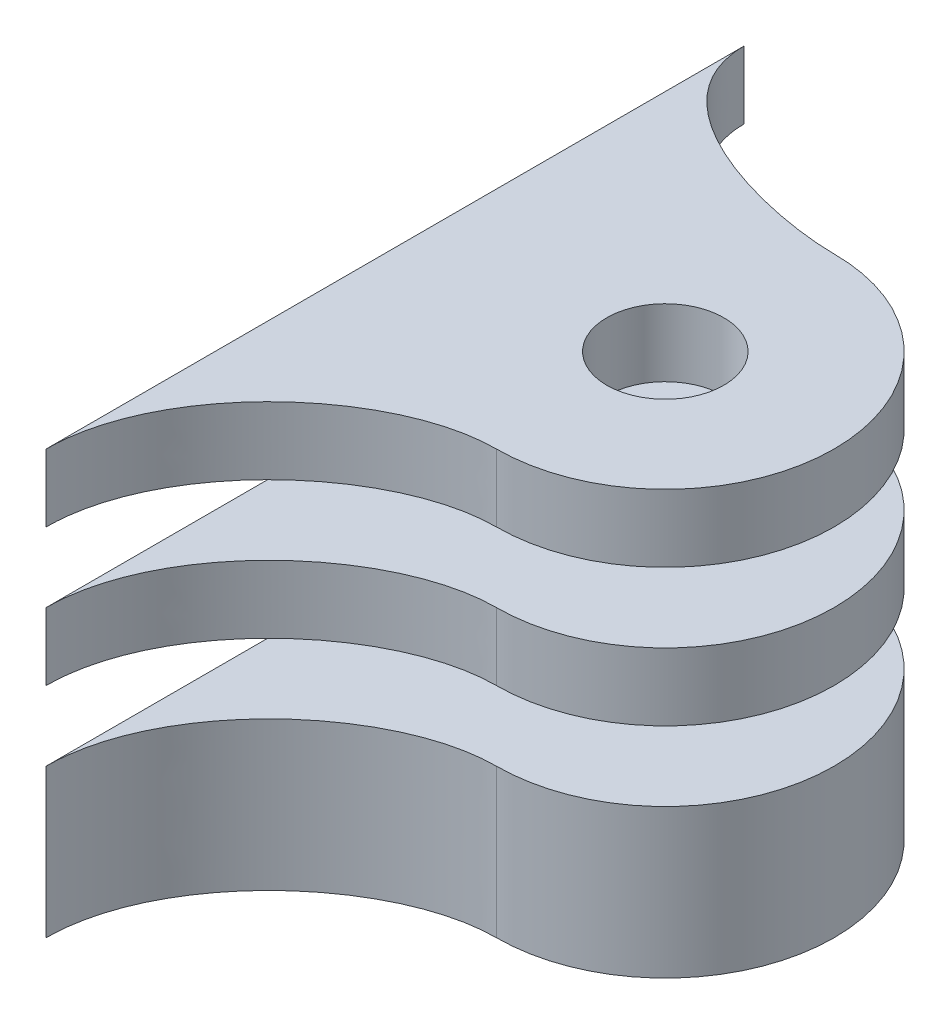
ISO-10303-21;
HEADER;
FILE_DESCRIPTION(('STEP AP214'),'2;1');
FILE_NAME('part.step','',(''),(''),'','','');
FILE_SCHEMA(('AUTOMOTIVE_DESIGN { 1 0 10303 214 1 1 1 1 }'));
ENDSEC;
DATA;
#1=APPLICATION_CONTEXT('core data for automotive mechanical design processes');
#2=APPLICATION_PROTOCOL_DEFINITION('international standard','automotive_design',2000,#1);
#3=PRODUCT_CONTEXT('',#1,'mechanical');
#4=PRODUCT('Part','Part','',(#3));
#5=PRODUCT_RELATED_PRODUCT_CATEGORY('part','',(#4));
#6=PRODUCT_DEFINITION_FORMATION('','',#4);
#7=PRODUCT_DEFINITION_CONTEXT('part definition',#1,'design');
#8=PRODUCT_DEFINITION('design','',#6,#7);
#9=PRODUCT_DEFINITION_SHAPE('','',#8);
#10=(LENGTH_UNIT() NAMED_UNIT(*) SI_UNIT(.MILLI.,.METRE.));
#11=(NAMED_UNIT(*) PLANE_ANGLE_UNIT() SI_UNIT($,.RADIAN.));
#12=(NAMED_UNIT(*) SI_UNIT($,.STERADIAN.) SOLID_ANGLE_UNIT());
#13=UNCERTAINTY_MEASURE_WITH_UNIT(LENGTH_MEASURE(1.E-05),#10,'distance_accuracy_value','');
#14=(GEOMETRIC_REPRESENTATION_CONTEXT(3) GLOBAL_UNCERTAINTY_ASSIGNED_CONTEXT((#13)) GLOBAL_UNIT_ASSIGNED_CONTEXT((#10,
#11,#12)) REPRESENTATION_CONTEXT('',''));
#15=CARTESIAN_POINT('',(0.,0.,0.));
#16=DIRECTION('',(0.,0.,1.));
#17=DIRECTION('',(1.,0.,0.));
#18=AXIS2_PLACEMENT_3D('',#15,#16,#17);
#19=CARTESIAN_POINT('',(0.,12.2,7.5));
#20=CARTESIAN_POINT('',(-4.57269446377672,12.2,7.50000000000003));
#21=CARTESIAN_POINT('',(-9.99999999999998,12.2,12.3758328504829));
#22=CARTESIAN_POINT('',(-10.,12.2,17.5));
#23=B_SPLINE_CURVE_WITH_KNOTS('',3,(#19,#20,#21,#22),.UNSPECIFIED.,.F.,.F.,(4,4),(0.,1.),.UNSPECIFIED.);
#24=DIRECTION('',(0.,-1.,0.));
#25=VECTOR('',#24,1.);
#26=SURFACE_OF_LINEAR_EXTRUSION('',#23,#25);
#27=CARTESIAN_POINT('',(0.,9.2,7.5));
#28=CARTESIAN_POINT('',(-4.57269446377672,9.2,7.50000000000003));
#29=CARTESIAN_POINT('',(-9.99999999999998,9.2,12.3758328504829));
#30=CARTESIAN_POINT('',(-10.,9.2,17.5));
#31=B_SPLINE_CURVE_WITH_KNOTS('',3,(#27,#28,#29,#30),.UNSPECIFIED.,.F.,.F.,(4,4),(0.,1.),.UNSPECIFIED.);
#32=CARTESIAN_POINT('',(0.,9.2,7.5));
#33=VERTEX_POINT('',#32);
#34=CARTESIAN_POINT('',(-10.,9.2,17.5));
#35=VERTEX_POINT('',#34);
#36=EDGE_CURVE('E159',#33,#35,#31,.T.);
#37=ORIENTED_EDGE('',*,*,#36,.F.);
#38=DIRECTION('',(0.,-1.,0.));
#39=VECTOR('',#38,1.);
#40=CARTESIAN_POINT('',(0.,12.2,7.5));
#41=LINE('',#40,#39);
#42=CARTESIAN_POINT('',(0.,12.2,7.5));
#43=VERTEX_POINT('',#42);
#44=EDGE_CURVE('E13',#43,#33,#41,.T.);
#45=ORIENTED_EDGE('',*,*,#44,.F.);
#46=CARTESIAN_POINT('',(-10.,12.2,17.5));
#47=VERTEX_POINT('',#46);
#48=EDGE_CURVE('E129',#43,#47,#23,.T.);
#49=ORIENTED_EDGE('',*,*,#48,.T.);
#50=DIRECTION('',(0.,-1.,0.));
#51=VECTOR('',#50,1.);
#52=CARTESIAN_POINT('',(-10.,12.2,17.5));
#53=LINE('',#52,#51);
#54=EDGE_CURVE('E117',#47,#35,#53,.T.);
#55=ORIENTED_EDGE('',*,*,#54,.T.);
#56=EDGE_LOOP('',(#37,#45,#49,#55));
#57=FACE_BOUND('',#56,.T.);
#58=ADVANCED_FACE('F77',(#57),#26,.T.);
#59=CARTESIAN_POINT('',(0.,12.2,0.));
#60=DIRECTION('',(0.,-1.,0.));
#61=DIRECTION('',(0.,0.,-1.));
#62=AXIS2_PLACEMENT_3D('',#59,#60,#61);
#63=CYLINDRICAL_SURFACE('',#62,7.5);
#64=CARTESIAN_POINT('',(0.,9.2,0.));
#65=DIRECTION('',(0.,1.,0.));
#66=DIRECTION('',(0.,0.,1.));
#67=AXIS2_PLACEMENT_3D('',#64,#65,#66);
#68=CIRCLE('',#67,7.5);
#69=CARTESIAN_POINT('',(0.,9.2,-7.5));
#70=VERTEX_POINT('',#69);
#71=EDGE_CURVE('E134',#33,#70,#68,.T.);
#72=ORIENTED_EDGE('',*,*,#71,.T.);
#73=DIRECTION('',(0.,-1.,0.));
#74=VECTOR('',#73,1.);
#75=CARTESIAN_POINT('',(0.,12.2,-7.5));
#76=LINE('',#75,#74);
#77=CARTESIAN_POINT('',(0.,12.2,-7.5));
#78=VERTEX_POINT('',#77);
#79=EDGE_CURVE('E86',#78,#70,#76,.T.);
#80=ORIENTED_EDGE('',*,*,#79,.F.);
#81=CARTESIAN_POINT('',(0.,12.2,0.));
#82=DIRECTION('',(0.,1.,0.));
#83=DIRECTION('',(0.,0.,1.));
#84=AXIS2_PLACEMENT_3D('',#81,#82,#83);
#85=CIRCLE('',#84,7.5);
#86=EDGE_CURVE('E123',#43,#78,#85,.T.);
#87=ORIENTED_EDGE('',*,*,#86,.F.);
#88=ORIENTED_EDGE('',*,*,#44,.T.);
#89=EDGE_LOOP('',(#72,#80,#87,#88));
#90=FACE_BOUND('',#89,.T.);
#91=ADVANCED_FACE('F132',(#90),#63,.T.);
#92=CARTESIAN_POINT('',(0.,12.2,-7.5));
#93=CARTESIAN_POINT('',(-2.81326336994025,12.2,-7.49999999999998));
#94=CARTESIAN_POINT('',(-10.,12.2,-9.04091329359103));
#95=CARTESIAN_POINT('',(-10.,12.2,-13.5));
#96=B_SPLINE_CURVE_WITH_KNOTS('',3,(#92,#93,#94,#95),.UNSPECIFIED.,.F.,.F.,(4,4),(0.,1.),.UNSPECIFIED.);
#97=DIRECTION('',(0.,-1.,0.));
#98=VECTOR('',#97,1.);
#99=SURFACE_OF_LINEAR_EXTRUSION('',#96,#98);
#100=CARTESIAN_POINT('',(0.,9.2,-7.5));
#101=CARTESIAN_POINT('',(-2.81326336994025,9.2,-7.49999999999998));
#102=CARTESIAN_POINT('',(-10.,9.2,-9.04091329359103));
#103=CARTESIAN_POINT('',(-10.,9.2,-13.5));
#104=B_SPLINE_CURVE_WITH_KNOTS('',3,(#100,#101,#102,#103),.UNSPECIFIED.,.F.,.F.,(4,4),(0.,1.),.UNSPECIFIED.);
#105=CARTESIAN_POINT('',(-10.,9.2,-13.5));
#106=VERTEX_POINT('',#105);
#107=EDGE_CURVE('E110',#70,#106,#104,.T.);
#108=ORIENTED_EDGE('',*,*,#107,.T.);
#109=DIRECTION('',(0.,-1.,0.));
#110=VECTOR('',#109,1.);
#111=CARTESIAN_POINT('',(-10.,12.2,-13.5));
#112=LINE('',#111,#110);
#113=CARTESIAN_POINT('',(-10.,12.2,-13.5));
#114=VERTEX_POINT('',#113);
#115=EDGE_CURVE('E135',#114,#106,#112,.T.);
#116=ORIENTED_EDGE('',*,*,#115,.F.);
#117=EDGE_CURVE('E128',#78,#114,#96,.T.);
#118=ORIENTED_EDGE('',*,*,#117,.F.);
#119=ORIENTED_EDGE('',*,*,#79,.T.);
#120=EDGE_LOOP('',(#108,#116,#118,#119));
#121=FACE_BOUND('',#120,.T.);
#122=ADVANCED_FACE('F136',(#121),#99,.F.);
#123=CARTESIAN_POINT('',(-10.,12.2,0.));
#124=DIRECTION('',(1.,0.,0.));
#125=DIRECTION('',(0.,0.,-1.));
#126=AXIS2_PLACEMENT_3D('',#123,#124,#125);
#127=PLANE('',#126);
#128=DIRECTION('',(0.,0.,1.));
#129=VECTOR('',#128,1.);
#130=CARTESIAN_POINT('',(-10.,9.2,0.));
#131=LINE('',#130,#129);
#132=EDGE_CURVE('E173',#106,#35,#131,.T.);
#133=ORIENTED_EDGE('',*,*,#132,.T.);
#134=ORIENTED_EDGE('',*,*,#54,.F.);
#135=DIRECTION('',(0.,0.,1.));
#136=VECTOR('',#135,1.);
#137=CARTESIAN_POINT('',(-10.,12.2,0.));
#138=LINE('',#137,#136);
#139=EDGE_CURVE('E94',#114,#47,#138,.T.);
#140=ORIENTED_EDGE('',*,*,#139,.F.);
#141=ORIENTED_EDGE('',*,*,#115,.T.);
#142=EDGE_LOOP('',(#133,#134,#140,#141));
#143=FACE_BOUND('',#142,.T.);
#144=ADVANCED_FACE('F150',(#143),#127,.F.);
#145=CARTESIAN_POINT('',(0.,12.2,0.));
#146=DIRECTION('',(0.,-1.,0.));
#147=DIRECTION('',(0.,0.,-1.));
#148=AXIS2_PLACEMENT_3D('',#145,#146,#147);
#149=CYLINDRICAL_SURFACE('',#148,2.6);
#150=CARTESIAN_POINT('',(0.,12.2,0.));
#151=DIRECTION('',(0.,1.,0.));
#152=DIRECTION('',(0.,0.,1.));
#153=AXIS2_PLACEMENT_3D('',#150,#151,#152);
#154=CIRCLE('',#153,2.6);
#155=CARTESIAN_POINT('',(0.,12.2,2.6));
#156=VERTEX_POINT('',#155);
#157=EDGE_CURVE('E138',#156,#156,#154,.T.);
#158=ORIENTED_EDGE('',*,*,#157,.T.);
#159=EDGE_LOOP('',(#158));
#160=FACE_BOUND('',#159,.T.);
#161=CARTESIAN_POINT('',(0.,9.2,0.));
#162=DIRECTION('',(0.,1.,0.));
#163=DIRECTION('',(0.,0.,1.));
#164=AXIS2_PLACEMENT_3D('',#161,#162,#163);
#165=CIRCLE('',#164,2.6);
#166=CARTESIAN_POINT('',(0.,9.2,2.6));
#167=VERTEX_POINT('',#166);
#168=EDGE_CURVE('E178',#167,#167,#165,.T.);
#169=ORIENTED_EDGE('',*,*,#168,.F.);
#170=EDGE_LOOP('',(#169));
#171=FACE_BOUND('',#170,.T.);
#172=ADVANCED_FACE('F189',(#160,#171),#149,.F.);
#173=CARTESIAN_POINT('',(0.,12.2,0.));
#174=DIRECTION('',(0.,1.,0.));
#175=DIRECTION('',(0.,0.,1.));
#176=AXIS2_PLACEMENT_3D('',#173,#174,#175);
#177=PLANE('',#176);
#178=ORIENTED_EDGE('',*,*,#48,.F.);
#179=ORIENTED_EDGE('',*,*,#86,.T.);
#180=ORIENTED_EDGE('',*,*,#117,.T.);
#181=ORIENTED_EDGE('',*,*,#139,.T.);
#182=EDGE_LOOP('',(#178,#179,#180,#181));
#183=FACE_BOUND('',#182,.T.);
#184=ORIENTED_EDGE('',*,*,#157,.F.);
#185=EDGE_LOOP('',(#184));
#186=FACE_BOUND('',#185,.T.);
#187=ADVANCED_FACE('F125',(#183,#186),#177,.T.);
#188=CARTESIAN_POINT('',(0.,9.2,0.));
#189=DIRECTION('',(0.,1.,0.));
#190=DIRECTION('',(0.,0.,1.));
#191=AXIS2_PLACEMENT_3D('',#188,#189,#190);
#192=PLANE('',#191);
#193=ORIENTED_EDGE('',*,*,#36,.T.);
#194=ORIENTED_EDGE('',*,*,#132,.F.);
#195=ORIENTED_EDGE('',*,*,#107,.F.);
#196=ORIENTED_EDGE('',*,*,#71,.F.);
#197=EDGE_LOOP('',(#193,#194,#195,#196));
#198=FACE_BOUND('',#197,.T.);
#199=ORIENTED_EDGE('',*,*,#168,.T.);
#200=EDGE_LOOP('',(#199));
#201=FACE_BOUND('',#200,.T.);
#202=ADVANCED_FACE('F183',(#198,#201),#192,.F.);
#203=CLOSED_SHELL('',(#58,#91,#122,#144,#172,#187,#202));
#204=MANIFOLD_SOLID_BREP('B2',#203);
#205=CARTESIAN_POINT('',(0.,6.1,7.5));
#206=CARTESIAN_POINT('',(-4.57269446377672,6.1,7.50000000000003));
#207=CARTESIAN_POINT('',(-9.99999999999998,6.1,12.3758328504829));
#208=CARTESIAN_POINT('',(-10.,6.1,17.5));
#209=B_SPLINE_CURVE_WITH_KNOTS('',3,(#205,#206,#207,#208),.UNSPECIFIED.,.F.,.F.,(4,4),(0.,1.),.UNSPECIFIED.);
#210=DIRECTION('',(0.,-1.,0.));
#211=VECTOR('',#210,1.);
#212=SURFACE_OF_LINEAR_EXTRUSION('',#209,#211);
#213=CARTESIAN_POINT('',(0.,3.1,7.5));
#214=CARTESIAN_POINT('',(-4.57269446377672,3.1,7.50000000000003));
#215=CARTESIAN_POINT('',(-9.99999999999998,3.1,12.3758328504829));
#216=CARTESIAN_POINT('',(-10.,3.1,17.5));
#217=B_SPLINE_CURVE_WITH_KNOTS('',3,(#213,#214,#215,#216),.UNSPECIFIED.,.F.,.F.,(4,4),(0.,1.),.UNSPECIFIED.);
#218=CARTESIAN_POINT('',(0.,3.1,7.5));
#219=VERTEX_POINT('',#218);
#220=CARTESIAN_POINT('',(-10.,3.1,17.5));
#221=VERTEX_POINT('',#220);
#222=EDGE_CURVE('E359',#219,#221,#217,.T.);
#223=ORIENTED_EDGE('',*,*,#222,.F.);
#224=DIRECTION('',(0.,-1.,0.));
#225=VECTOR('',#224,1.);
#226=CARTESIAN_POINT('',(0.,6.1,7.5));
#227=LINE('',#226,#225);
#228=CARTESIAN_POINT('',(0.,6.1,7.5));
#229=VERTEX_POINT('',#228);
#230=EDGE_CURVE('E75',#229,#219,#227,.T.);
#231=ORIENTED_EDGE('',*,*,#230,.F.);
#232=CARTESIAN_POINT('',(-10.,6.1,17.5));
#233=VERTEX_POINT('',#232);
#234=EDGE_CURVE('E329',#229,#233,#209,.T.);
#235=ORIENTED_EDGE('',*,*,#234,.T.);
#236=DIRECTION('',(0.,-1.,0.));
#237=VECTOR('',#236,1.);
#238=CARTESIAN_POINT('',(-10.,6.1,17.5));
#239=LINE('',#238,#237);
#240=EDGE_CURVE('E317',#233,#221,#239,.T.);
#241=ORIENTED_EDGE('',*,*,#240,.T.);
#242=EDGE_LOOP('',(#223,#231,#235,#241));
#243=FACE_BOUND('',#242,.T.);
#244=ADVANCED_FACE('F277',(#243),#212,.T.);
#245=CARTESIAN_POINT('',(0.,6.1,0.));
#246=DIRECTION('',(0.,-1.,0.));
#247=DIRECTION('',(0.,0.,-1.));
#248=AXIS2_PLACEMENT_3D('',#245,#246,#247);
#249=CYLINDRICAL_SURFACE('',#248,7.5);
#250=CARTESIAN_POINT('',(0.,3.1,0.));
#251=DIRECTION('',(0.,1.,0.));
#252=DIRECTION('',(0.,0.,1.));
#253=AXIS2_PLACEMENT_3D('',#250,#251,#252);
#254=CIRCLE('',#253,7.5);
#255=CARTESIAN_POINT('',(0.,3.1,-7.5));
#256=VERTEX_POINT('',#255);
#257=EDGE_CURVE('E334',#219,#256,#254,.T.);
#258=ORIENTED_EDGE('',*,*,#257,.T.);
#259=DIRECTION('',(0.,-1.,0.));
#260=VECTOR('',#259,1.);
#261=CARTESIAN_POINT('',(0.,6.1,-7.5));
#262=LINE('',#261,#260);
#263=CARTESIAN_POINT('',(0.,6.1,-7.5));
#264=VERTEX_POINT('',#263);
#265=EDGE_CURVE('E286',#264,#256,#262,.T.);
#266=ORIENTED_EDGE('',*,*,#265,.F.);
#267=CARTESIAN_POINT('',(0.,6.1,0.));
#268=DIRECTION('',(0.,1.,0.));
#269=DIRECTION('',(0.,0.,1.));
#270=AXIS2_PLACEMENT_3D('',#267,#268,#269);
#271=CIRCLE('',#270,7.5);
#272=EDGE_CURVE('E323',#229,#264,#271,.T.);
#273=ORIENTED_EDGE('',*,*,#272,.F.);
#274=ORIENTED_EDGE('',*,*,#230,.T.);
#275=EDGE_LOOP('',(#258,#266,#273,#274));
#276=FACE_BOUND('',#275,.T.);
#277=ADVANCED_FACE('F332',(#276),#249,.T.);
#278=CARTESIAN_POINT('',(0.,6.1,-7.5));
#279=CARTESIAN_POINT('',(-2.81326336994025,6.1,-7.49999999999998));
#280=CARTESIAN_POINT('',(-10.,6.1,-9.04091329359103));
#281=CARTESIAN_POINT('',(-10.,6.1,-13.5));
#282=B_SPLINE_CURVE_WITH_KNOTS('',3,(#278,#279,#280,#281),.UNSPECIFIED.,.F.,.F.,(4,4),(0.,1.),.UNSPECIFIED.);
#283=DIRECTION('',(0.,-1.,0.));
#284=VECTOR('',#283,1.);
#285=SURFACE_OF_LINEAR_EXTRUSION('',#282,#284);
#286=CARTESIAN_POINT('',(0.,3.1,-7.5));
#287=CARTESIAN_POINT('',(-2.81326336994025,3.1,-7.49999999999998));
#288=CARTESIAN_POINT('',(-10.,3.1,-9.04091329359103));
#289=CARTESIAN_POINT('',(-10.,3.1,-13.5));
#290=B_SPLINE_CURVE_WITH_KNOTS('',3,(#286,#287,#288,#289),.UNSPECIFIED.,.F.,.F.,(4,4),(0.,1.),.UNSPECIFIED.);
#291=CARTESIAN_POINT('',(-10.,3.1,-13.5));
#292=VERTEX_POINT('',#291);
#293=EDGE_CURVE('E310',#256,#292,#290,.T.);
#294=ORIENTED_EDGE('',*,*,#293,.T.);
#295=DIRECTION('',(0.,-1.,0.));
#296=VECTOR('',#295,1.);
#297=CARTESIAN_POINT('',(-10.,6.1,-13.5));
#298=LINE('',#297,#296);
#299=CARTESIAN_POINT('',(-10.,6.1,-13.5));
#300=VERTEX_POINT('',#299);
#301=EDGE_CURVE('E335',#300,#292,#298,.T.);
#302=ORIENTED_EDGE('',*,*,#301,.F.);
#303=EDGE_CURVE('E328',#264,#300,#282,.T.);
#304=ORIENTED_EDGE('',*,*,#303,.F.);
#305=ORIENTED_EDGE('',*,*,#265,.T.);
#306=EDGE_LOOP('',(#294,#302,#304,#305));
#307=FACE_BOUND('',#306,.T.);
#308=ADVANCED_FACE('F336',(#307),#285,.F.);
#309=CARTESIAN_POINT('',(-10.,6.1,0.));
#310=DIRECTION('',(1.,0.,0.));
#311=DIRECTION('',(0.,0.,-1.));
#312=AXIS2_PLACEMENT_3D('',#309,#310,#311);
#313=PLANE('',#312);
#314=DIRECTION('',(0.,0.,1.));
#315=VECTOR('',#314,1.);
#316=CARTESIAN_POINT('',(-10.,3.1,0.));
#317=LINE('',#316,#315);
#318=EDGE_CURVE('E373',#292,#221,#317,.T.);
#319=ORIENTED_EDGE('',*,*,#318,.T.);
#320=ORIENTED_EDGE('',*,*,#240,.F.);
#321=DIRECTION('',(0.,0.,1.));
#322=VECTOR('',#321,1.);
#323=CARTESIAN_POINT('',(-10.,6.1,0.));
#324=LINE('',#323,#322);
#325=EDGE_CURVE('E294',#300,#233,#324,.T.);
#326=ORIENTED_EDGE('',*,*,#325,.F.);
#327=ORIENTED_EDGE('',*,*,#301,.T.);
#328=EDGE_LOOP('',(#319,#320,#326,#327));
#329=FACE_BOUND('',#328,.T.);
#330=ADVANCED_FACE('F350',(#329),#313,.F.);
#331=CARTESIAN_POINT('',(0.,6.1,0.));
#332=DIRECTION('',(0.,-1.,0.));
#333=DIRECTION('',(0.,0.,-1.));
#334=AXIS2_PLACEMENT_3D('',#331,#332,#333);
#335=CYLINDRICAL_SURFACE('',#334,2.6);
#336=CARTESIAN_POINT('',(0.,6.1,0.));
#337=DIRECTION('',(0.,1.,0.));
#338=DIRECTION('',(0.,0.,1.));
#339=AXIS2_PLACEMENT_3D('',#336,#337,#338);
#340=CIRCLE('',#339,2.6);
#341=CARTESIAN_POINT('',(0.,6.1,2.6));
#342=VERTEX_POINT('',#341);
#343=EDGE_CURVE('E338',#342,#342,#340,.T.);
#344=ORIENTED_EDGE('',*,*,#343,.T.);
#345=EDGE_LOOP('',(#344));
#346=FACE_BOUND('',#345,.T.);
#347=CARTESIAN_POINT('',(0.,3.1,0.));
#348=DIRECTION('',(0.,1.,0.));
#349=DIRECTION('',(0.,0.,1.));
#350=AXIS2_PLACEMENT_3D('',#347,#348,#349);
#351=CIRCLE('',#350,2.6);
#352=CARTESIAN_POINT('',(0.,3.1,2.6));
#353=VERTEX_POINT('',#352);
#354=EDGE_CURVE('E378',#353,#353,#351,.T.);
#355=ORIENTED_EDGE('',*,*,#354,.F.);
#356=EDGE_LOOP('',(#355));
#357=FACE_BOUND('',#356,.T.);
#358=ADVANCED_FACE('F389',(#346,#357),#335,.F.);
#359=CARTESIAN_POINT('',(0.,6.1,0.));
#360=DIRECTION('',(0.,1.,0.));
#361=DIRECTION('',(0.,0.,1.));
#362=AXIS2_PLACEMENT_3D('',#359,#360,#361);
#363=PLANE('',#362);
#364=ORIENTED_EDGE('',*,*,#234,.F.);
#365=ORIENTED_EDGE('',*,*,#272,.T.);
#366=ORIENTED_EDGE('',*,*,#303,.T.);
#367=ORIENTED_EDGE('',*,*,#325,.T.);
#368=EDGE_LOOP('',(#364,#365,#366,#367));
#369=FACE_BOUND('',#368,.T.);
#370=ORIENTED_EDGE('',*,*,#343,.F.);
#371=EDGE_LOOP('',(#370));
#372=FACE_BOUND('',#371,.T.);
#373=ADVANCED_FACE('F325',(#369,#372),#363,.T.);
#374=CARTESIAN_POINT('',(0.,3.1,0.));
#375=DIRECTION('',(0.,1.,0.));
#376=DIRECTION('',(0.,0.,1.));
#377=AXIS2_PLACEMENT_3D('',#374,#375,#376);
#378=PLANE('',#377);
#379=ORIENTED_EDGE('',*,*,#222,.T.);
#380=ORIENTED_EDGE('',*,*,#318,.F.);
#381=ORIENTED_EDGE('',*,*,#293,.F.);
#382=ORIENTED_EDGE('',*,*,#257,.F.);
#383=EDGE_LOOP('',(#379,#380,#381,#382));
#384=FACE_BOUND('',#383,.T.);
#385=ORIENTED_EDGE('',*,*,#354,.T.);
#386=EDGE_LOOP('',(#385));
#387=FACE_BOUND('',#386,.T.);
#388=ADVANCED_FACE('F383',(#384,#387),#378,.F.);
#389=CLOSED_SHELL('',(#244,#277,#308,#330,#358,#373,#388));
#390=MANIFOLD_SOLID_BREP('B7',#389);
#391=CARTESIAN_POINT('',(0.,-3.,0.));
#392=DIRECTION('',(0.,1.,0.));
#393=DIRECTION('',(0.,0.,1.));
#394=AXIS2_PLACEMENT_3D('',#391,#392,#393);
#395=CYLINDRICAL_SURFACE('',#394,2.6);
#396=CARTESIAN_POINT('',(0.,-3.,0.));
#397=DIRECTION('',(0.,1.,0.));
#398=DIRECTION('',(0.,0.,1.));
#399=AXIS2_PLACEMENT_3D('',#396,#397,#398);
#400=CIRCLE('',#399,2.6);
#401=CARTESIAN_POINT('',(0.,-3.,2.6));
#402=VERTEX_POINT('',#401);
#403=EDGE_CURVE('E617',#402,#402,#400,.T.);
#404=ORIENTED_EDGE('',*,*,#403,.F.);
#405=EDGE_LOOP('',(#404));
#406=FACE_BOUND('',#405,.T.);
#407=CARTESIAN_POINT('',(0.,0.,0.));
#408=DIRECTION('',(0.,1.,0.));
#409=DIRECTION('',(0.,0.,1.));
#410=AXIS2_PLACEMENT_3D('',#407,#408,#409);
#411=CIRCLE('',#410,2.6);
#412=CARTESIAN_POINT('',(0.,0.,2.6));
#413=VERTEX_POINT('',#412);
#414=EDGE_CURVE('E695',#413,#413,#411,.T.);
#415=ORIENTED_EDGE('',*,*,#414,.T.);
#416=EDGE_LOOP('',(#415));
#417=FACE_BOUND('',#416,.T.);
#418=ADVANCED_FACE('F468',(#406,#417),#395,.F.);
#419=CARTESIAN_POINT('',(-10.,-3.,0.));
#420=DIRECTION('',(-1.,0.,0.));
#421=DIRECTION('',(0.,0.,1.));
#422=AXIS2_PLACEMENT_3D('',#419,#420,#421);
#423=PLANE('',#422);
#424=DIRECTION('',(0.,0.,1.));
#425=VECTOR('',#424,1.);
#426=CARTESIAN_POINT('',(-10.,0.,0.));
#427=LINE('',#426,#425);
#428=CARTESIAN_POINT('',(-10.,0.,-13.5));
#429=VERTEX_POINT('',#428);
#430=CARTESIAN_POINT('',(-10.,0.,17.5));
#431=VERTEX_POINT('',#430);
#432=EDGE_CURVE('E503',#429,#431,#427,.T.);
#433=ORIENTED_EDGE('',*,*,#432,.F.);
#434=DIRECTION('',(0.,1.,0.));
#435=VECTOR('',#434,1.);
#436=CARTESIAN_POINT('',(-10.,-3.,-13.5));
#437=LINE('',#436,#435);
#438=CARTESIAN_POINT('',(-10.,-6.6,-13.5));
#439=VERTEX_POINT('',#438);
#440=EDGE_CURVE('E473',#439,#429,#437,.T.);
#441=ORIENTED_EDGE('',*,*,#440,.F.);
#442=DIRECTION('',(0.,0.,-1.));
#443=VECTOR('',#442,1.);
#444=CARTESIAN_POINT('',(-10.,-6.6,0.));
#445=LINE('',#444,#443);
#446=CARTESIAN_POINT('',(-10.,-6.6,17.5));
#447=VERTEX_POINT('',#446);
#448=EDGE_CURVE('E568',#447,#439,#445,.T.);
#449=ORIENTED_EDGE('',*,*,#448,.F.);
#450=DIRECTION('',(0.,1.,0.));
#451=VECTOR('',#450,1.);
#452=CARTESIAN_POINT('',(-10.,-3.,17.5));
#453=LINE('',#452,#451);
#454=EDGE_CURVE('E275',#447,#431,#453,.T.);
#455=ORIENTED_EDGE('',*,*,#454,.T.);
#456=EDGE_LOOP('',(#433,#441,#449,#455));
#457=FACE_BOUND('',#456,.T.);
#458=ADVANCED_FACE('F572',(#457),#423,.T.);
#459=CARTESIAN_POINT('',(0.,-3.,0.));
#460=DIRECTION('',(0.,1.,0.));
#461=DIRECTION('',(0.,0.,1.));
#462=AXIS2_PLACEMENT_3D('',#459,#460,#461);
#463=CYLINDRICAL_SURFACE('',#462,7.5);
#464=CARTESIAN_POINT('',(0.,0.,0.));
#465=DIRECTION('',(0.,1.,0.));
#466=DIRECTION('',(0.,0.,1.));
#467=AXIS2_PLACEMENT_3D('',#464,#465,#466);
#468=CIRCLE('',#467,7.5);
#469=CARTESIAN_POINT('',(0.,0.,7.5));
#470=VERTEX_POINT('',#469);
#471=CARTESIAN_POINT('',(0.,0.,-7.5));
#472=VERTEX_POINT('',#471);
#473=EDGE_CURVE('E701',#470,#472,#468,.T.);
#474=ORIENTED_EDGE('',*,*,#473,.F.);
#475=DIRECTION('',(0.,1.,0.));
#476=VECTOR('',#475,1.);
#477=CARTESIAN_POINT('',(0.,-3.,7.5));
#478=LINE('',#477,#476);
#479=CARTESIAN_POINT('',(0.,-6.6,7.5));
#480=VERTEX_POINT('',#479);
#481=EDGE_CURVE('E694',#480,#470,#478,.T.);
#482=ORIENTED_EDGE('',*,*,#481,.F.);
#483=CARTESIAN_POINT('',(0.,-6.6,0.));
#484=DIRECTION('',(0.,-1.,0.));
#485=DIRECTION('',(0.,0.,-1.));
#486=AXIS2_PLACEMENT_3D('',#483,#484,#485);
#487=CIRCLE('',#486,7.5);
#488=CARTESIAN_POINT('',(0.,-6.6,-7.5));
#489=VERTEX_POINT('',#488);
#490=EDGE_CURVE('E570',#489,#480,#487,.T.);
#491=ORIENTED_EDGE('',*,*,#490,.F.);
#492=DIRECTION('',(0.,1.,0.));
#493=VECTOR('',#492,1.);
#494=CARTESIAN_POINT('',(0.,-3.,-7.5));
#495=LINE('',#494,#493);
#496=EDGE_CURVE('E478',#489,#472,#495,.T.);
#497=ORIENTED_EDGE('',*,*,#496,.T.);
#498=EDGE_LOOP('',(#474,#482,#491,#497));
#499=FACE_BOUND('',#498,.T.);
#500=ADVANCED_FACE('F625',(#499),#463,.T.);
#501=CARTESIAN_POINT('',(0.,-3.,7.5));
#502=CARTESIAN_POINT('',(-4.57269446377672,-3.,7.50000000000003));
#503=CARTESIAN_POINT('',(-9.99999999999998,-3.,12.3758328504829));
#504=CARTESIAN_POINT('',(-10.,-3.,17.5));
#505=B_SPLINE_CURVE_WITH_KNOTS('',3,(#501,#502,#503,#504),.UNSPECIFIED.,.F.,.F.,(4,4),(0.,1.),.UNSPECIFIED.);
#506=DIRECTION('',(0.,1.,0.));
#507=VECTOR('',#506,1.);
#508=SURFACE_OF_LINEAR_EXTRUSION('',#505,#507);
#509=CARTESIAN_POINT('',(0.,0.,7.5));
#510=CARTESIAN_POINT('',(-4.57269446377672,0.,7.50000000000003));
#511=CARTESIAN_POINT('',(-9.99999999999998,0.,12.3758328504829));
#512=CARTESIAN_POINT('',(-10.,0.,17.5));
#513=B_SPLINE_CURVE_WITH_KNOTS('',3,(#509,#510,#511,#512),.UNSPECIFIED.,.F.,.F.,(4,4),(0.,1.),.UNSPECIFIED.);
#514=EDGE_CURVE('E564',#470,#431,#513,.T.);
#515=ORIENTED_EDGE('',*,*,#514,.T.);
#516=ORIENTED_EDGE('',*,*,#454,.F.);
#517=CARTESIAN_POINT('',(0.,-6.6,7.5));
#518=CARTESIAN_POINT('',(-4.57269446377672,-6.6,7.50000000000003));
#519=CARTESIAN_POINT('',(-9.99999999999998,-6.6,12.3758328504829));
#520=CARTESIAN_POINT('',(-10.,-6.6,17.5));
#521=B_SPLINE_CURVE_WITH_KNOTS('',3,(#517,#518,#519,#520),.UNSPECIFIED.,.F.,.F.,(4,4),(0.,1.),.UNSPECIFIED.);
#522=EDGE_CURVE('E561',#480,#447,#521,.T.);
#523=ORIENTED_EDGE('',*,*,#522,.F.);
#524=ORIENTED_EDGE('',*,*,#481,.T.);
#525=EDGE_LOOP('',(#515,#516,#523,#524));
#526=FACE_BOUND('',#525,.T.);
#527=ADVANCED_FACE('F560',(#526),#508,.F.);
#528=CARTESIAN_POINT('',(0.,0.,0.));
#529=DIRECTION('',(0.,1.,0.));
#530=DIRECTION('',(0.,0.,1.));
#531=AXIS2_PLACEMENT_3D('',#528,#529,#530);
#532=PLANE('',#531);
#533=ORIENTED_EDGE('',*,*,#514,.F.);
#534=ORIENTED_EDGE('',*,*,#473,.T.);
#535=CARTESIAN_POINT('',(0.,0.,-7.5));
#536=CARTESIAN_POINT('',(-2.81326336994025,0.,-7.49999999999998));
#537=CARTESIAN_POINT('',(-10.,0.,-9.04091329359103));
#538=CARTESIAN_POINT('',(-10.,0.,-13.5));
#539=B_SPLINE_CURVE_WITH_KNOTS('',3,(#535,#536,#537,#538),.UNSPECIFIED.,.F.,.F.,(4,4),(0.,1.),.UNSPECIFIED.);
#540=EDGE_CURVE('E612',#472,#429,#539,.T.);
#541=ORIENTED_EDGE('',*,*,#540,.T.);
#542=ORIENTED_EDGE('',*,*,#432,.T.);
#543=EDGE_LOOP('',(#533,#534,#541,#542));
#544=FACE_BOUND('',#543,.T.);
#545=ORIENTED_EDGE('',*,*,#414,.F.);
#546=EDGE_LOOP('',(#545));
#547=FACE_BOUND('',#546,.T.);
#548=ADVANCED_FACE('F624',(#544,#547),#532,.T.);
#549=CARTESIAN_POINT('',(0.,-3.,0.));
#550=DIRECTION('',(0.,1.,0.));
#551=DIRECTION('',(0.,0.,1.));
#552=AXIS2_PLACEMENT_3D('',#549,#550,#551);
#553=PLANE('',#552);
#554=DIRECTION('',(0.866025403784439,0.,0.5));
#555=VECTOR('',#554,1.);
#556=CARTESIAN_POINT('',(2.025,-3.,-3.50740288532698));
#557=LINE('',#556,#555);
#558=CARTESIAN_POINT('',(0.,-3.,-4.67653718043597));
#559=VERTEX_POINT('',#558);
#560=CARTESIAN_POINT('',(4.05,-3.,-2.33826859021798));
#561=VERTEX_POINT('',#560);
#562=EDGE_CURVE('E588',#559,#561,#557,.T.);
#563=ORIENTED_EDGE('',*,*,#562,.T.);
#564=DIRECTION('',(0.,0.,1.));
#565=VECTOR('',#564,1.);
#566=CARTESIAN_POINT('',(4.05,-3.,0.));
#567=LINE('',#566,#565);
#568=CARTESIAN_POINT('',(4.05,-3.,2.33826859021799));
#569=VERTEX_POINT('',#568);
#570=EDGE_CURVE('E582',#561,#569,#567,.T.);
#571=ORIENTED_EDGE('',*,*,#570,.T.);
#572=DIRECTION('',(-0.866025403784439,0.,0.5));
#573=VECTOR('',#572,1.);
#574=CARTESIAN_POINT('',(2.025,-3.,3.50740288532698));
#575=LINE('',#574,#573);
#576=CARTESIAN_POINT('',(0.,-3.,4.67653718043597));
#577=VERTEX_POINT('',#576);
#578=EDGE_CURVE('E598',#569,#577,#575,.T.);
#579=ORIENTED_EDGE('',*,*,#578,.T.);
#580=DIRECTION('',(-0.866025403784439,0.,-0.5));
#581=VECTOR('',#580,1.);
#582=CARTESIAN_POINT('',(-2.025,-3.,3.50740288532698));
#583=LINE('',#582,#581);
#584=CARTESIAN_POINT('',(-4.05,-3.,2.33826859021798));
#585=VERTEX_POINT('',#584);
#586=EDGE_CURVE('E486',#577,#585,#583,.T.);
#587=ORIENTED_EDGE('',*,*,#586,.T.);
#588=DIRECTION('',(0.,0.,-1.));
#589=VECTOR('',#588,1.);
#590=CARTESIAN_POINT('',(-4.05,-3.,0.));
#591=LINE('',#590,#589);
#592=CARTESIAN_POINT('',(-4.05,-3.,-2.33826859021799));
#593=VERTEX_POINT('',#592);
#594=EDGE_CURVE('E594',#585,#593,#591,.T.);
#595=ORIENTED_EDGE('',*,*,#594,.T.);
#596=DIRECTION('',(0.866025403784439,0.,-0.5));
#597=VECTOR('',#596,1.);
#598=CARTESIAN_POINT('',(-2.025,-3.,-3.50740288532698));
#599=LINE('',#598,#597);
#600=EDGE_CURVE('E591',#593,#559,#599,.T.);
#601=ORIENTED_EDGE('',*,*,#600,.T.);
#602=EDGE_LOOP('',(#563,#571,#579,#587,#595,#601));
#603=FACE_BOUND('',#602,.T.);
#604=ORIENTED_EDGE('',*,*,#403,.T.);
#605=EDGE_LOOP('',(#604));
#606=FACE_BOUND('',#605,.T.);
#607=ADVANCED_FACE('F636',(#603,#606),#553,.F.);
#608=CARTESIAN_POINT('',(0.,-3.,-7.5));
#609=CARTESIAN_POINT('',(-2.81326336994025,-3.,-7.49999999999998));
#610=CARTESIAN_POINT('',(-10.,-3.,-9.04091329359103));
#611=CARTESIAN_POINT('',(-10.,-3.,-13.5));
#612=B_SPLINE_CURVE_WITH_KNOTS('',3,(#608,#609,#610,#611),.UNSPECIFIED.,.F.,.F.,(4,4),(0.,1.),.UNSPECIFIED.);
#613=DIRECTION('',(0.,1.,0.));
#614=VECTOR('',#613,1.);
#615=SURFACE_OF_LINEAR_EXTRUSION('',#612,#614);
#616=ORIENTED_EDGE('',*,*,#540,.F.);
#617=ORIENTED_EDGE('',*,*,#496,.F.);
#618=CARTESIAN_POINT('',(-10.,-6.6,-13.5));
#619=CARTESIAN_POINT('',(-10.,-6.6,-9.04091329359103));
#620=CARTESIAN_POINT('',(-2.81326336994025,-6.6,-7.49999999999998));
#621=CARTESIAN_POINT('',(0.,-6.6,-7.5));
#622=B_SPLINE_CURVE_WITH_KNOTS('',3,(#618,#619,#620,#621),.UNSPECIFIED.,.F.,.F.,(4,4),(0.,1.),.UNSPECIFIED.);
#623=EDGE_CURVE('E573',#439,#489,#622,.T.);
#624=ORIENTED_EDGE('',*,*,#623,.F.);
#625=ORIENTED_EDGE('',*,*,#440,.T.);
#626=EDGE_LOOP('',(#616,#617,#624,#625));
#627=FACE_BOUND('',#626,.T.);
#628=ADVANCED_FACE('F470',(#627),#615,.T.);
#629=CARTESIAN_POINT('',(4.05,-6.6,0.));
#630=DIRECTION('',(-1.,0.,0.));
#631=DIRECTION('',(0.,0.,1.));
#632=AXIS2_PLACEMENT_3D('',#629,#630,#631);
#633=PLANE('',#632);
#634=ORIENTED_EDGE('',*,*,#570,.F.);
#635=DIRECTION('',(0.,1.,0.));
#636=VECTOR('',#635,1.);
#637=CARTESIAN_POINT('',(4.05,-6.6,-2.33826859021798));
#638=LINE('',#637,#636);
#639=CARTESIAN_POINT('',(4.05,-6.6,-2.33826859021798));
#640=VERTEX_POINT('',#639);
#641=EDGE_CURVE('E540',#640,#561,#638,.T.);
#642=ORIENTED_EDGE('',*,*,#641,.F.);
#643=DIRECTION('',(0.,0.,1.));
#644=VECTOR('',#643,1.);
#645=CARTESIAN_POINT('',(4.05,-6.6,0.));
#646=LINE('',#645,#644);
#647=CARTESIAN_POINT('',(4.05,-6.6,2.33826859021799));
#648=VERTEX_POINT('',#647);
#649=EDGE_CURVE('E601',#640,#648,#646,.T.);
#650=ORIENTED_EDGE('',*,*,#649,.T.);
#651=DIRECTION('',(0.,1.,0.));
#652=VECTOR('',#651,1.);
#653=CARTESIAN_POINT('',(4.05,-6.6,2.33826859021799));
#654=LINE('',#653,#652);
#655=EDGE_CURVE('E535',#648,#569,#654,.T.);
#656=ORIENTED_EDGE('',*,*,#655,.T.);
#657=EDGE_LOOP('',(#634,#642,#650,#656));
#658=FACE_BOUND('',#657,.T.);
#659=ADVANCED_FACE('F641',(#658),#633,.T.);
#660=CARTESIAN_POINT('',(2.025,-6.6,-3.50740288532698));
#661=DIRECTION('',(-0.5,0.,0.866025403784438));
#662=DIRECTION('',(0.866025403784439,0.,0.5));
#663=AXIS2_PLACEMENT_3D('',#660,#661,#662);
#664=PLANE('',#663);
#665=ORIENTED_EDGE('',*,*,#562,.F.);
#666=DIRECTION('',(0.,1.,0.));
#667=VECTOR('',#666,1.);
#668=CARTESIAN_POINT('',(0.,-6.6,-4.67653718043597));
#669=LINE('',#668,#667);
#670=CARTESIAN_POINT('',(0.,-6.6,-4.67653718043597));
#671=VERTEX_POINT('',#670);
#672=EDGE_CURVE('E609',#671,#559,#669,.T.);
#673=ORIENTED_EDGE('',*,*,#672,.F.);
#674=DIRECTION('',(0.866025403784439,0.,0.5));
#675=VECTOR('',#674,1.);
#676=CARTESIAN_POINT('',(2.025,-6.6,-3.50740288532698));
#677=LINE('',#676,#675);
#678=EDGE_CURVE('E671',#671,#640,#677,.T.);
#679=ORIENTED_EDGE('',*,*,#678,.T.);
#680=ORIENTED_EDGE('',*,*,#641,.T.);
#681=EDGE_LOOP('',(#665,#673,#679,#680));
#682=FACE_BOUND('',#681,.T.);
#683=ADVANCED_FACE('F644',(#682),#664,.T.);
#684=CARTESIAN_POINT('',(-2.025,-6.6,-3.50740288532698));
#685=DIRECTION('',(0.5,0.,0.866025403784439));
#686=DIRECTION('',(0.866025403784439,0.,-0.5));
#687=AXIS2_PLACEMENT_3D('',#684,#685,#686);
#688=PLANE('',#687);
#689=ORIENTED_EDGE('',*,*,#600,.F.);
#690=DIRECTION('',(0.,1.,0.));
#691=VECTOR('',#690,1.);
#692=CARTESIAN_POINT('',(-4.05,-6.6,-2.33826859021799));
#693=LINE('',#692,#691);
#694=CARTESIAN_POINT('',(-4.05,-6.6,-2.33826859021799));
#695=VERTEX_POINT('',#694);
#696=EDGE_CURVE('E607',#695,#593,#693,.T.);
#697=ORIENTED_EDGE('',*,*,#696,.F.);
#698=DIRECTION('',(0.866025403784439,0.,-0.5));
#699=VECTOR('',#698,1.);
#700=CARTESIAN_POINT('',(-2.025,-6.6,-3.50740288532698));
#701=LINE('',#700,#699);
#702=EDGE_CURVE('E678',#695,#671,#701,.T.);
#703=ORIENTED_EDGE('',*,*,#702,.T.);
#704=ORIENTED_EDGE('',*,*,#672,.T.);
#705=EDGE_LOOP('',(#689,#697,#703,#704));
#706=FACE_BOUND('',#705,.T.);
#707=ADVANCED_FACE('F647',(#706),#688,.T.);
#708=CARTESIAN_POINT('',(-4.05,-6.6,0.));
#709=DIRECTION('',(1.,0.,0.));
#710=DIRECTION('',(0.,0.,-1.));
#711=AXIS2_PLACEMENT_3D('',#708,#709,#710);
#712=PLANE('',#711);
#713=ORIENTED_EDGE('',*,*,#594,.F.);
#714=DIRECTION('',(0.,1.,0.));
#715=VECTOR('',#714,1.);
#716=CARTESIAN_POINT('',(-4.05,-6.6,2.33826859021798));
#717=LINE('',#716,#715);
#718=CARTESIAN_POINT('',(-4.05,-6.6,2.33826859021798));
#719=VERTEX_POINT('',#718);
#720=EDGE_CURVE('E605',#719,#585,#717,.T.);
#721=ORIENTED_EDGE('',*,*,#720,.F.);
#722=DIRECTION('',(0.,0.,-1.));
#723=VECTOR('',#722,1.);
#724=CARTESIAN_POINT('',(-4.05,-6.6,0.));
#725=LINE('',#724,#723);
#726=EDGE_CURVE('E680',#719,#695,#725,.T.);
#727=ORIENTED_EDGE('',*,*,#726,.T.);
#728=ORIENTED_EDGE('',*,*,#696,.T.);
#729=EDGE_LOOP('',(#713,#721,#727,#728));
#730=FACE_BOUND('',#729,.T.);
#731=ADVANCED_FACE('F651',(#730),#712,.T.);
#732=CARTESIAN_POINT('',(-2.025,-6.6,3.50740288532698));
#733=DIRECTION('',(0.5,0.,-0.866025403784439));
#734=DIRECTION('',(-0.866025403784439,0.,-0.5));
#735=AXIS2_PLACEMENT_3D('',#732,#733,#734);
#736=PLANE('',#735);
#737=ORIENTED_EDGE('',*,*,#586,.F.);
#738=DIRECTION('',(0.,1.,0.));
#739=VECTOR('',#738,1.);
#740=CARTESIAN_POINT('',(0.,-6.6,4.67653718043597));
#741=LINE('',#740,#739);
#742=CARTESIAN_POINT('',(0.,-6.6,4.67653718043597));
#743=VERTEX_POINT('',#742);
#744=EDGE_CURVE('E603',#743,#577,#741,.T.);
#745=ORIENTED_EDGE('',*,*,#744,.F.);
#746=DIRECTION('',(-0.866025403784439,0.,-0.5));
#747=VECTOR('',#746,1.);
#748=CARTESIAN_POINT('',(-2.025,-6.6,3.50740288532698));
#749=LINE('',#748,#747);
#750=EDGE_CURVE('E685',#743,#719,#749,.T.);
#751=ORIENTED_EDGE('',*,*,#750,.T.);
#752=ORIENTED_EDGE('',*,*,#720,.T.);
#753=EDGE_LOOP('',(#737,#745,#751,#752));
#754=FACE_BOUND('',#753,.T.);
#755=ADVANCED_FACE('F655',(#754),#736,.T.);
#756=CARTESIAN_POINT('',(2.025,-6.6,3.50740288532698));
#757=DIRECTION('',(-0.5,0.,-0.866025403784439));
#758=DIRECTION('',(-0.866025403784439,0.,0.5));
#759=AXIS2_PLACEMENT_3D('',#756,#757,#758);
#760=PLANE('',#759);
#761=ORIENTED_EDGE('',*,*,#578,.F.);
#762=ORIENTED_EDGE('',*,*,#655,.F.);
#763=DIRECTION('',(-0.866025403784439,0.,0.5));
#764=VECTOR('',#763,1.);
#765=CARTESIAN_POINT('',(2.025,-6.6,3.50740288532698));
#766=LINE('',#765,#764);
#767=EDGE_CURVE('E675',#648,#743,#766,.T.);
#768=ORIENTED_EDGE('',*,*,#767,.T.);
#769=ORIENTED_EDGE('',*,*,#744,.T.);
#770=EDGE_LOOP('',(#761,#762,#768,#769));
#771=FACE_BOUND('',#770,.T.);
#772=ADVANCED_FACE('F659',(#771),#760,.T.);
#773=CARTESIAN_POINT('',(0.,-6.6,0.));
#774=DIRECTION('',(0.,-1.,0.));
#775=DIRECTION('',(0.,0.,-1.));
#776=AXIS2_PLACEMENT_3D('',#773,#774,#775);
#777=PLANE('',#776);
#778=ORIENTED_EDGE('',*,*,#649,.F.);
#779=ORIENTED_EDGE('',*,*,#678,.F.);
#780=ORIENTED_EDGE('',*,*,#702,.F.);
#781=ORIENTED_EDGE('',*,*,#726,.F.);
#782=ORIENTED_EDGE('',*,*,#750,.F.);
#783=ORIENTED_EDGE('',*,*,#767,.F.);
#784=EDGE_LOOP('',(#778,#779,#780,#781,#782,#783));
#785=FACE_BOUND('',#784,.T.);
#786=ORIENTED_EDGE('',*,*,#490,.T.);
#787=ORIENTED_EDGE('',*,*,#522,.T.);
#788=ORIENTED_EDGE('',*,*,#448,.T.);
#789=ORIENTED_EDGE('',*,*,#623,.T.);
#790=EDGE_LOOP('',(#786,#787,#788,#789));
#791=FACE_BOUND('',#790,.T.);
#792=ADVANCED_FACE('F567',(#785,#791),#777,.T.);
#793=CLOSED_SHELL('',(#418,#458,#500,#527,#548,#607,#628,#659,#683,#707,#731,#755,#772,#792));
#794=MANIFOLD_SOLID_BREP('B69',#793);
#795=ADVANCED_BREP_SHAPE_REPRESENTATION('',(#18,#204,#390,#794),#14);
#796=SHAPE_DEFINITION_REPRESENTATION(#9,#795);
ENDSEC;
END-ISO-10303-21;
